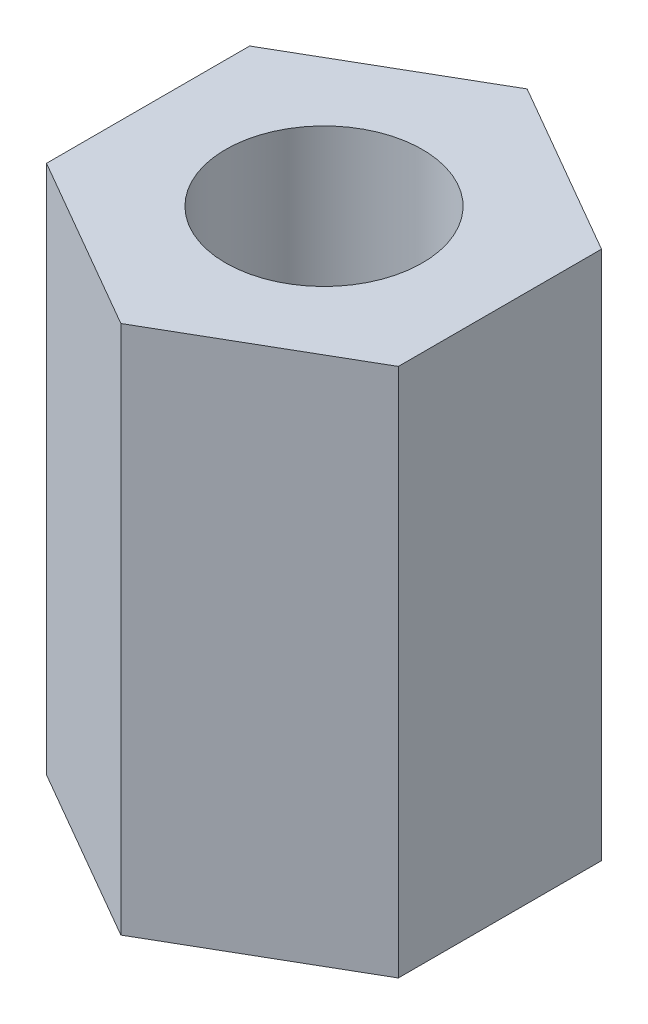
ISO-10303-21;
HEADER;
FILE_DESCRIPTION(('STEP AP214'),'2;1');
FILE_NAME('part.step','',(''),(''),'','','');
FILE_SCHEMA(('AUTOMOTIVE_DESIGN { 1 0 10303 214 1 1 1 1 }'));
ENDSEC;
DATA;
#1=APPLICATION_CONTEXT('core data for automotive mechanical design processes');
#2=APPLICATION_PROTOCOL_DEFINITION('international standard','automotive_design',2000,#1);
#3=PRODUCT_CONTEXT('',#1,'mechanical');
#4=PRODUCT('Part','Part','',(#3));
#5=PRODUCT_RELATED_PRODUCT_CATEGORY('part','',(#4));
#6=PRODUCT_DEFINITION_FORMATION('','',#4);
#7=PRODUCT_DEFINITION_CONTEXT('part definition',#1,'design');
#8=PRODUCT_DEFINITION('design','',#6,#7);
#9=PRODUCT_DEFINITION_SHAPE('','',#8);
#10=(LENGTH_UNIT() NAMED_UNIT(*) SI_UNIT(.MILLI.,.METRE.));
#11=(NAMED_UNIT(*) PLANE_ANGLE_UNIT() SI_UNIT($,.RADIAN.));
#12=(NAMED_UNIT(*) SI_UNIT($,.STERADIAN.) SOLID_ANGLE_UNIT());
#13=UNCERTAINTY_MEASURE_WITH_UNIT(LENGTH_MEASURE(1.E-05),#10,'distance_accuracy_value','');
#14=(GEOMETRIC_REPRESENTATION_CONTEXT(3) GLOBAL_UNCERTAINTY_ASSIGNED_CONTEXT((#13)) GLOBAL_UNIT_ASSIGNED_CONTEXT((#10,
#11,#12)) REPRESENTATION_CONTEXT('',''));
#15=CARTESIAN_POINT('',(0.,0.,0.));
#16=DIRECTION('',(0.,0.,1.));
#17=DIRECTION('',(1.,0.,0.));
#18=AXIS2_PLACEMENT_3D('',#15,#16,#17);
#19=CARTESIAN_POINT('',(0.,7.,0.));
#20=DIRECTION('',(0.,1.,0.));
#21=DIRECTION('',(0.,0.,1.));
#22=AXIS2_PLACEMENT_3D('',#19,#20,#21);
#23=PLANE('',#22);
#24=DIRECTION('',(0.866025403784439,0.,0.5));
#25=VECTOR('',#24,1.);
#26=CARTESIAN_POINT('',(-2.325,7.,1.34233937586588));
#27=LINE('',#26,#25);
#28=CARTESIAN_POINT('',(-2.325,7.,1.34233937586588));
#29=VERTEX_POINT('',#28);
#30=CARTESIAN_POINT('',(0.,7.,2.68467875173176));
#31=VERTEX_POINT('',#30);
#32=EDGE_CURVE('E129',#29,#31,#27,.T.);
#33=ORIENTED_EDGE('',*,*,#32,.T.);
#34=DIRECTION('',(0.866025403784439,0.,-0.5));
#35=VECTOR('',#34,1.);
#36=CARTESIAN_POINT('',(0.,7.,2.68467875173176));
#37=LINE('',#36,#35);
#38=CARTESIAN_POINT('',(2.325,7.,1.34233937586588));
#39=VERTEX_POINT('',#38);
#40=EDGE_CURVE('E87',#31,#39,#37,.T.);
#41=ORIENTED_EDGE('',*,*,#40,.T.);
#42=DIRECTION('',(0.,0.,-1.));
#43=VECTOR('',#42,1.);
#44=CARTESIAN_POINT('',(2.325,7.,1.34233937586588));
#45=LINE('',#44,#43);
#46=CARTESIAN_POINT('',(2.325,7.,-1.34233937586588));
#47=VERTEX_POINT('',#46);
#48=EDGE_CURVE('E100',#39,#47,#45,.T.);
#49=ORIENTED_EDGE('',*,*,#48,.T.);
#50=DIRECTION('',(-0.866025403784439,0.,-0.5));
#51=VECTOR('',#50,1.);
#52=CARTESIAN_POINT('',(2.325,7.,-1.34233937586588));
#53=LINE('',#52,#51);
#54=CARTESIAN_POINT('',(0.,7.,-2.68467875173176));
#55=VERTEX_POINT('',#54);
#56=EDGE_CURVE('E94',#47,#55,#53,.T.);
#57=ORIENTED_EDGE('',*,*,#56,.T.);
#58=DIRECTION('',(-0.866025403784439,0.,0.5));
#59=VECTOR('',#58,1.);
#60=CARTESIAN_POINT('',(0.,7.,-2.68467875173176));
#61=LINE('',#60,#59);
#62=CARTESIAN_POINT('',(-2.325,7.,-1.34233937586588));
#63=VERTEX_POINT('',#62);
#64=EDGE_CURVE('E98',#55,#63,#61,.T.);
#65=ORIENTED_EDGE('',*,*,#64,.T.);
#66=DIRECTION('',(0.,0.,1.));
#67=VECTOR('',#66,1.);
#68=CARTESIAN_POINT('',(-2.325,7.,-1.34233937586588));
#69=LINE('',#68,#67);
#70=EDGE_CURVE('E50',#63,#29,#69,.T.);
#71=ORIENTED_EDGE('',*,*,#70,.T.);
#72=EDGE_LOOP('',(#33,#41,#49,#57,#65,#71));
#73=FACE_BOUND('',#72,.T.);
#74=CARTESIAN_POINT('',(0.,7.,0.));
#75=DIRECTION('',(0.,1.,0.));
#76=DIRECTION('',(0.,0.,1.));
#77=AXIS2_PLACEMENT_3D('',#74,#75,#76);
#78=CIRCLE('',#77,1.3);
#79=CARTESIAN_POINT('',(0.,7.,1.3));
#80=VERTEX_POINT('',#79);
#81=EDGE_CURVE('E122',#80,#80,#78,.T.);
#82=ORIENTED_EDGE('',*,*,#81,.F.);
#83=EDGE_LOOP('',(#82));
#84=FACE_BOUND('',#83,.T.);
#85=ADVANCED_FACE('F33',(#73,#84),#23,.T.);
#86=CARTESIAN_POINT('',(0.,0.,0.));
#87=DIRECTION('',(0.,1.,0.));
#88=DIRECTION('',(0.,0.,1.));
#89=AXIS2_PLACEMENT_3D('',#86,#87,#88);
#90=PLANE('',#89);
#91=DIRECTION('',(0.866025403784439,0.,0.5));
#92=VECTOR('',#91,1.);
#93=CARTESIAN_POINT('',(-2.325,0.,1.34233937586588));
#94=LINE('',#93,#92);
#95=CARTESIAN_POINT('',(-2.325,0.,1.34233937586588));
#96=VERTEX_POINT('',#95);
#97=CARTESIAN_POINT('',(0.,0.,2.68467875173176));
#98=VERTEX_POINT('',#97);
#99=EDGE_CURVE('E118',#96,#98,#94,.T.);
#100=ORIENTED_EDGE('',*,*,#99,.F.);
#101=DIRECTION('',(0.,0.,1.));
#102=VECTOR('',#101,1.);
#103=CARTESIAN_POINT('',(-2.325,0.,-1.34233937586588));
#104=LINE('',#103,#102);
#105=CARTESIAN_POINT('',(-2.325,0.,-1.34233937586588));
#106=VERTEX_POINT('',#105);
#107=EDGE_CURVE('E79',#106,#96,#104,.T.);
#108=ORIENTED_EDGE('',*,*,#107,.F.);
#109=DIRECTION('',(-0.866025403784439,0.,0.5));
#110=VECTOR('',#109,1.);
#111=CARTESIAN_POINT('',(0.,0.,-2.68467875173176));
#112=LINE('',#111,#110);
#113=CARTESIAN_POINT('',(0.,0.,-2.68467875173176));
#114=VERTEX_POINT('',#113);
#115=EDGE_CURVE('E73',#114,#106,#112,.T.);
#116=ORIENTED_EDGE('',*,*,#115,.F.);
#117=DIRECTION('',(-0.866025403784439,0.,-0.5));
#118=VECTOR('',#117,1.);
#119=CARTESIAN_POINT('',(2.325,0.,-1.34233937586588));
#120=LINE('',#119,#118);
#121=CARTESIAN_POINT('',(2.325,0.,-1.34233937586588));
#122=VERTEX_POINT('',#121);
#123=EDGE_CURVE('E108',#122,#114,#120,.T.);
#124=ORIENTED_EDGE('',*,*,#123,.F.);
#125=DIRECTION('',(0.,0.,-1.));
#126=VECTOR('',#125,1.);
#127=CARTESIAN_POINT('',(2.325,0.,1.34233937586588));
#128=LINE('',#127,#126);
#129=CARTESIAN_POINT('',(2.325,0.,1.34233937586588));
#130=VERTEX_POINT('',#129);
#131=EDGE_CURVE('E124',#130,#122,#128,.T.);
#132=ORIENTED_EDGE('',*,*,#131,.F.);
#133=DIRECTION('',(0.866025403784439,0.,-0.5));
#134=VECTOR('',#133,1.);
#135=CARTESIAN_POINT('',(0.,0.,2.68467875173176));
#136=LINE('',#135,#134);
#137=EDGE_CURVE('E121',#98,#130,#136,.T.);
#138=ORIENTED_EDGE('',*,*,#137,.F.);
#139=EDGE_LOOP('',(#100,#108,#116,#124,#132,#138));
#140=FACE_BOUND('',#139,.T.);
#141=CARTESIAN_POINT('',(0.,0.,0.));
#142=DIRECTION('',(0.,1.,0.));
#143=DIRECTION('',(0.,0.,1.));
#144=AXIS2_PLACEMENT_3D('',#141,#142,#143);
#145=CIRCLE('',#144,1.3);
#146=CARTESIAN_POINT('',(0.,0.,1.3));
#147=VERTEX_POINT('',#146);
#148=EDGE_CURVE('E222',#147,#147,#145,.T.);
#149=ORIENTED_EDGE('',*,*,#148,.T.);
#150=EDGE_LOOP('',(#149));
#151=FACE_BOUND('',#150,.T.);
#152=ADVANCED_FACE('F138',(#140,#151),#90,.F.);
#153=CARTESIAN_POINT('',(-2.325,7.,1.34233937586588));
#154=DIRECTION('',(0.5,0.,-0.866025403784438));
#155=DIRECTION('',(-0.866025403784439,0.,-0.5));
#156=AXIS2_PLACEMENT_3D('',#153,#154,#155);
#157=PLANE('',#156);
#158=ORIENTED_EDGE('',*,*,#99,.T.);
#159=DIRECTION('',(0.,-1.,0.));
#160=VECTOR('',#159,1.);
#161=CARTESIAN_POINT('',(0.,7.,2.68467875173176));
#162=LINE('',#161,#160);
#163=EDGE_CURVE('E11',#31,#98,#162,.T.);
#164=ORIENTED_EDGE('',*,*,#163,.F.);
#165=ORIENTED_EDGE('',*,*,#32,.F.);
#166=DIRECTION('',(0.,-1.,0.));
#167=VECTOR('',#166,1.);
#168=CARTESIAN_POINT('',(-2.325,7.,1.34233937586588));
#169=LINE('',#168,#167);
#170=EDGE_CURVE('E114',#29,#96,#169,.T.);
#171=ORIENTED_EDGE('',*,*,#170,.T.);
#172=EDGE_LOOP('',(#158,#164,#165,#171));
#173=FACE_BOUND('',#172,.T.);
#174=ADVANCED_FACE('F35',(#173),#157,.F.);
#175=CARTESIAN_POINT('',(0.,7.,2.68467875173176));
#176=DIRECTION('',(-0.5,0.,-0.866025403784439));
#177=DIRECTION('',(-0.866025403784439,0.,0.5));
#178=AXIS2_PLACEMENT_3D('',#175,#176,#177);
#179=PLANE('',#178);
#180=ORIENTED_EDGE('',*,*,#137,.T.);
#181=DIRECTION('',(0.,-1.,0.));
#182=VECTOR('',#181,1.);
#183=CARTESIAN_POINT('',(2.325,7.,1.34233937586588));
#184=LINE('',#183,#182);
#185=EDGE_CURVE('E42',#39,#130,#184,.T.);
#186=ORIENTED_EDGE('',*,*,#185,.F.);
#187=ORIENTED_EDGE('',*,*,#40,.F.);
#188=ORIENTED_EDGE('',*,*,#163,.T.);
#189=EDGE_LOOP('',(#180,#186,#187,#188));
#190=FACE_BOUND('',#189,.T.);
#191=ADVANCED_FACE('F163',(#190),#179,.F.);
#192=CARTESIAN_POINT('',(2.325,7.,1.34233937586588));
#193=DIRECTION('',(-1.,0.,0.));
#194=DIRECTION('',(0.,0.,1.));
#195=AXIS2_PLACEMENT_3D('',#192,#193,#194);
#196=PLANE('',#195);
#197=ORIENTED_EDGE('',*,*,#131,.T.);
#198=DIRECTION('',(0.,-1.,0.));
#199=VECTOR('',#198,1.);
#200=CARTESIAN_POINT('',(2.325,7.,-1.34233937586588));
#201=LINE('',#200,#199);
#202=EDGE_CURVE('E109',#47,#122,#201,.T.);
#203=ORIENTED_EDGE('',*,*,#202,.F.);
#204=ORIENTED_EDGE('',*,*,#48,.F.);
#205=ORIENTED_EDGE('',*,*,#185,.T.);
#206=EDGE_LOOP('',(#197,#203,#204,#205));
#207=FACE_BOUND('',#206,.T.);
#208=ADVANCED_FACE('F135',(#207),#196,.F.);
#209=CARTESIAN_POINT('',(2.325,7.,-1.34233937586588));
#210=DIRECTION('',(-0.5,0.,0.866025403784439));
#211=DIRECTION('',(0.866025403784439,0.,0.5));
#212=AXIS2_PLACEMENT_3D('',#209,#210,#211);
#213=PLANE('',#212);
#214=ORIENTED_EDGE('',*,*,#123,.T.);
#215=DIRECTION('',(0.,-1.,0.));
#216=VECTOR('',#215,1.);
#217=CARTESIAN_POINT('',(0.,7.,-2.68467875173176));
#218=LINE('',#217,#216);
#219=EDGE_CURVE('E105',#55,#114,#218,.T.);
#220=ORIENTED_EDGE('',*,*,#219,.F.);
#221=ORIENTED_EDGE('',*,*,#56,.F.);
#222=ORIENTED_EDGE('',*,*,#202,.T.);
#223=EDGE_LOOP('',(#214,#220,#221,#222));
#224=FACE_BOUND('',#223,.T.);
#225=ADVANCED_FACE('F106',(#224),#213,.F.);
#226=CARTESIAN_POINT('',(0.,7.,-2.68467875173176));
#227=DIRECTION('',(0.5,0.,0.866025403784439));
#228=DIRECTION('',(0.866025403784439,0.,-0.5));
#229=AXIS2_PLACEMENT_3D('',#226,#227,#228);
#230=PLANE('',#229);
#231=ORIENTED_EDGE('',*,*,#115,.T.);
#232=DIRECTION('',(0.,-1.,0.));
#233=VECTOR('',#232,1.);
#234=CARTESIAN_POINT('',(-2.325,7.,-1.34233937586588));
#235=LINE('',#234,#233);
#236=EDGE_CURVE('E110',#63,#106,#235,.T.);
#237=ORIENTED_EDGE('',*,*,#236,.F.);
#238=ORIENTED_EDGE('',*,*,#64,.F.);
#239=ORIENTED_EDGE('',*,*,#219,.T.);
#240=EDGE_LOOP('',(#231,#237,#238,#239));
#241=FACE_BOUND('',#240,.T.);
#242=ADVANCED_FACE('F112',(#241),#230,.F.);
#243=CARTESIAN_POINT('',(-2.325,7.,-1.34233937586588));
#244=DIRECTION('',(1.,0.,0.));
#245=DIRECTION('',(0.,0.,-1.));
#246=AXIS2_PLACEMENT_3D('',#243,#244,#245);
#247=PLANE('',#246);
#248=ORIENTED_EDGE('',*,*,#107,.T.);
#249=ORIENTED_EDGE('',*,*,#170,.F.);
#250=ORIENTED_EDGE('',*,*,#70,.F.);
#251=ORIENTED_EDGE('',*,*,#236,.T.);
#252=EDGE_LOOP('',(#248,#249,#250,#251));
#253=FACE_BOUND('',#252,.T.);
#254=ADVANCED_FACE('F143',(#253),#247,.F.);
#255=CARTESIAN_POINT('',(0.,7.,0.));
#256=DIRECTION('',(0.,-1.,0.));
#257=DIRECTION('',(0.,0.,-1.));
#258=AXIS2_PLACEMENT_3D('',#255,#256,#257);
#259=CYLINDRICAL_SURFACE('',#258,1.3);
#260=ORIENTED_EDGE('',*,*,#81,.T.);
#261=EDGE_LOOP('',(#260));
#262=FACE_BOUND('',#261,.T.);
#263=ORIENTED_EDGE('',*,*,#148,.F.);
#264=EDGE_LOOP('',(#263));
#265=FACE_BOUND('',#264,.T.);
#266=ADVANCED_FACE('F145',(#262,#265),#259,.F.);
#267=CLOSED_SHELL('',(#85,#152,#174,#191,#208,#225,#242,#254,#266));
#268=MANIFOLD_SOLID_BREP('B2',#267);
#269=ADVANCED_BREP_SHAPE_REPRESENTATION('',(#18,#268),#14);
#270=SHAPE_DEFINITION_REPRESENTATION(#9,#269);
ENDSEC;
END-ISO-10303-21;
